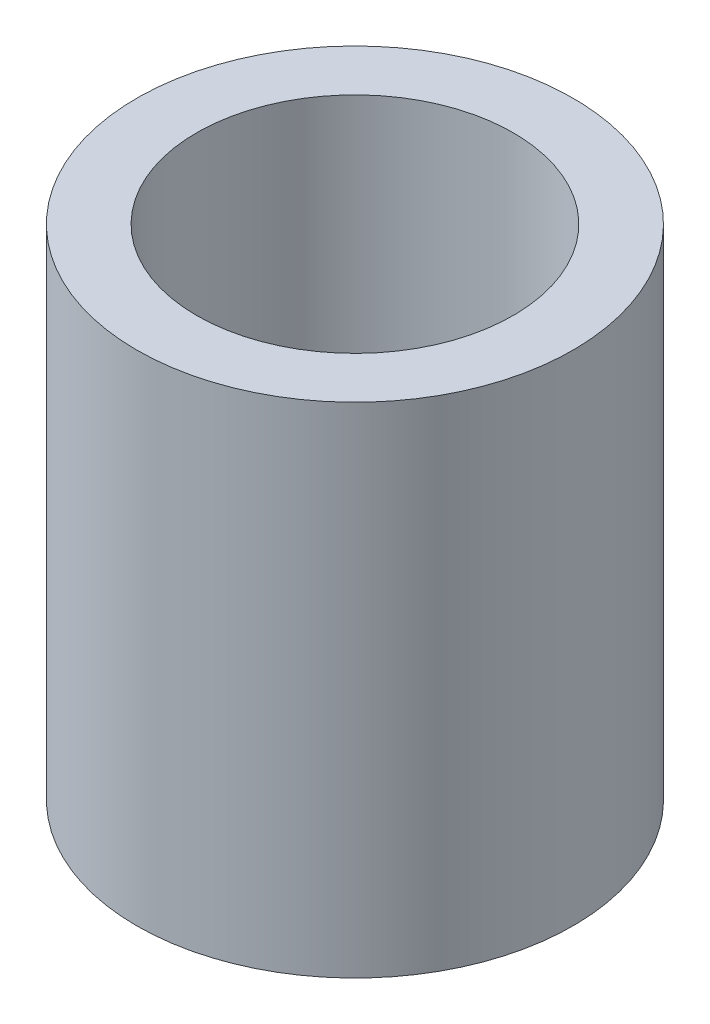
ISO-10303-21;
HEADER;
FILE_DESCRIPTION(('STEP AP214'),'2;1');
FILE_NAME('part.step','',(''),(''),'','','');
FILE_SCHEMA(('AUTOMOTIVE_DESIGN { 1 0 10303 214 1 1 1 1 }'));
ENDSEC;
DATA;
#1=APPLICATION_CONTEXT('core data for automotive mechanical design processes');
#2=APPLICATION_PROTOCOL_DEFINITION('international standard','automotive_design',2000,#1);
#3=PRODUCT_CONTEXT('',#1,'mechanical');
#4=PRODUCT('Part','Part','',(#3));
#5=PRODUCT_RELATED_PRODUCT_CATEGORY('part','',(#4));
#6=PRODUCT_DEFINITION_FORMATION('','',#4);
#7=PRODUCT_DEFINITION_CONTEXT('part definition',#1,'design');
#8=PRODUCT_DEFINITION('design','',#6,#7);
#9=PRODUCT_DEFINITION_SHAPE('','',#8);
#10=(LENGTH_UNIT() NAMED_UNIT(*) SI_UNIT(.MILLI.,.METRE.));
#11=(NAMED_UNIT(*) PLANE_ANGLE_UNIT() SI_UNIT($,.RADIAN.));
#12=(NAMED_UNIT(*) SI_UNIT($,.STERADIAN.) SOLID_ANGLE_UNIT());
#13=UNCERTAINTY_MEASURE_WITH_UNIT(LENGTH_MEASURE(1.E-05),#10,'distance_accuracy_value','');
#14=(GEOMETRIC_REPRESENTATION_CONTEXT(3) GLOBAL_UNCERTAINTY_ASSIGNED_CONTEXT((#13)) GLOBAL_UNIT_ASSIGNED_CONTEXT((#10,
#11,#12)) REPRESENTATION_CONTEXT('',''));
#15=CARTESIAN_POINT('',(0.,0.,0.));
#16=DIRECTION('',(0.,0.,1.));
#17=DIRECTION('',(1.,0.,0.));
#18=AXIS2_PLACEMENT_3D('',#15,#16,#17);
#19=CARTESIAN_POINT('',(0.,4.,0.));
#20=DIRECTION('',(0.,1.,0.));
#21=DIRECTION('',(0.,0.,1.));
#22=AXIS2_PLACEMENT_3D('',#19,#20,#21);
#23=PLANE('',#22);
#24=CARTESIAN_POINT('',(0.,4.,0.));
#25=DIRECTION('',(0.,1.,0.));
#26=DIRECTION('',(0.,0.,1.));
#27=AXIS2_PLACEMENT_3D('',#24,#25,#26);
#28=CIRCLE('',#27,3.5);
#29=CARTESIAN_POINT('',(0.,4.,3.5));
#30=VERTEX_POINT('',#29);
#31=EDGE_CURVE('E10',#30,#30,#28,.T.);
#32=ORIENTED_EDGE('',*,*,#31,.T.);
#33=EDGE_LOOP('',(#32));
#34=FACE_BOUND('',#33,.T.);
#35=CARTESIAN_POINT('',(0.,4.,0.));
#36=DIRECTION('',(0.,1.,0.));
#37=DIRECTION('',(0.,0.,1.));
#38=AXIS2_PLACEMENT_3D('',#35,#36,#37);
#39=CIRCLE('',#38,2.54);
#40=CARTESIAN_POINT('',(0.,4.,2.54));
#41=VERTEX_POINT('',#40);
#42=EDGE_CURVE('E52',#41,#41,#39,.T.);
#43=ORIENTED_EDGE('',*,*,#42,.F.);
#44=EDGE_LOOP('',(#43));
#45=FACE_BOUND('',#44,.T.);
#46=ADVANCED_FACE('F39',(#34,#45),#23,.T.);
#47=CARTESIAN_POINT('',(0.,-4.,0.));
#48=DIRECTION('',(0.,1.,0.));
#49=DIRECTION('',(0.,0.,1.));
#50=AXIS2_PLACEMENT_3D('',#47,#48,#49);
#51=PLANE('',#50);
#52=CARTESIAN_POINT('',(0.,-4.,0.));
#53=DIRECTION('',(0.,1.,0.));
#54=DIRECTION('',(0.,0.,1.));
#55=AXIS2_PLACEMENT_3D('',#52,#53,#54);
#56=CIRCLE('',#55,3.5);
#57=CARTESIAN_POINT('',(0.,-4.,3.5));
#58=VERTEX_POINT('',#57);
#59=EDGE_CURVE('E43',#58,#58,#56,.T.);
#60=ORIENTED_EDGE('',*,*,#59,.F.);
#61=EDGE_LOOP('',(#60));
#62=FACE_BOUND('',#61,.T.);
#63=CARTESIAN_POINT('',(0.,-4.,0.));
#64=DIRECTION('',(0.,1.,0.));
#65=DIRECTION('',(0.,0.,1.));
#66=AXIS2_PLACEMENT_3D('',#63,#64,#65);
#67=CIRCLE('',#66,2.54);
#68=CARTESIAN_POINT('',(0.,-4.,2.54));
#69=VERTEX_POINT('',#68);
#70=EDGE_CURVE('E54',#69,#69,#67,.T.);
#71=ORIENTED_EDGE('',*,*,#70,.T.);
#72=EDGE_LOOP('',(#71));
#73=FACE_BOUND('',#72,.T.);
#74=ADVANCED_FACE('F66',(#62,#73),#51,.F.);
#75=CARTESIAN_POINT('',(0.,4.,0.));
#76=DIRECTION('',(0.,-1.,0.));
#77=DIRECTION('',(0.,0.,-1.));
#78=AXIS2_PLACEMENT_3D('',#75,#76,#77);
#79=CYLINDRICAL_SURFACE('',#78,3.5);
#80=ORIENTED_EDGE('',*,*,#31,.F.);
#81=EDGE_LOOP('',(#80));
#82=FACE_BOUND('',#81,.T.);
#83=ORIENTED_EDGE('',*,*,#59,.T.);
#84=EDGE_LOOP('',(#83));
#85=FACE_BOUND('',#84,.T.);
#86=ADVANCED_FACE('F41',(#82,#85),#79,.T.);
#87=CARTESIAN_POINT('',(0.,4.,0.));
#88=DIRECTION('',(0.,-1.,0.));
#89=DIRECTION('',(0.,0.,-1.));
#90=AXIS2_PLACEMENT_3D('',#87,#88,#89);
#91=CYLINDRICAL_SURFACE('',#90,2.54);
#92=ORIENTED_EDGE('',*,*,#42,.T.);
#93=EDGE_LOOP('',(#92));
#94=FACE_BOUND('',#93,.T.);
#95=ORIENTED_EDGE('',*,*,#70,.F.);
#96=EDGE_LOOP('',(#95));
#97=FACE_BOUND('',#96,.T.);
#98=ADVANCED_FACE('F62',(#94,#97),#91,.F.);
#99=CLOSED_SHELL('',(#46,#74,#86,#98));
#100=MANIFOLD_SOLID_BREP('B2',#99);
#101=ADVANCED_BREP_SHAPE_REPRESENTATION('',(#18,#100),#14);
#102=SHAPE_DEFINITION_REPRESENTATION(#9,#101);
ENDSEC;
END-ISO-10303-21;
